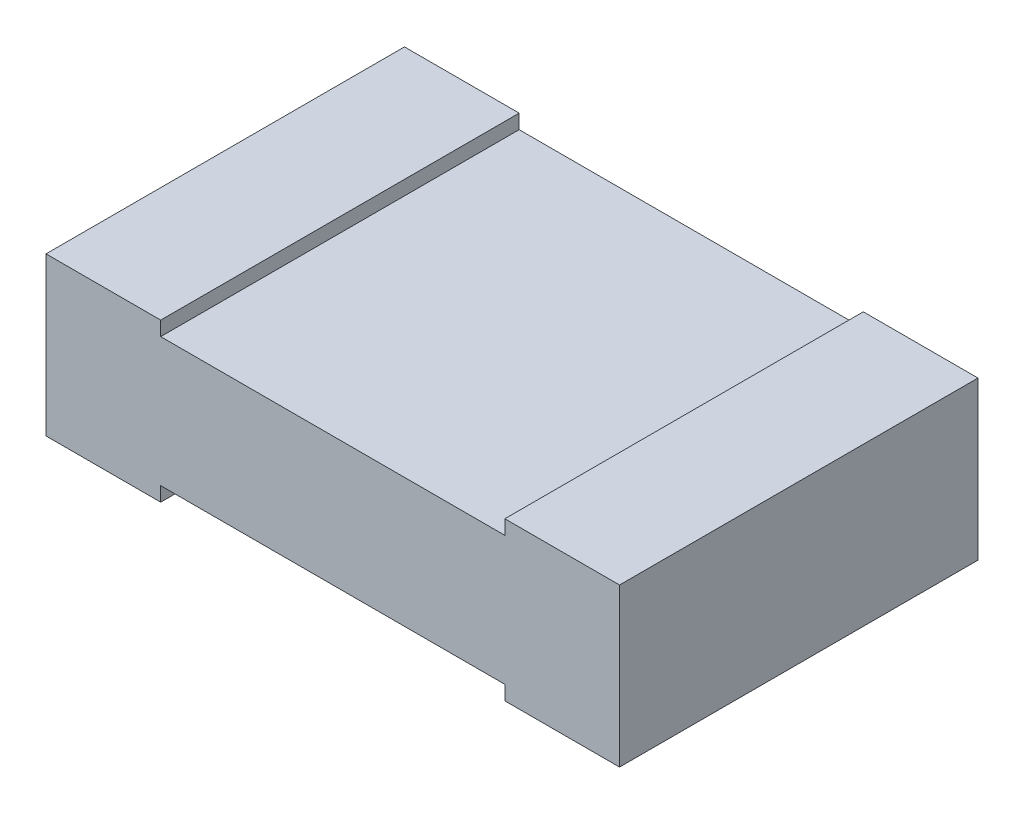
ISO-10303-21;
HEADER;
FILE_DESCRIPTION(('STEP AP214'),'2;1');
FILE_NAME('part.step','',(''),(''),'','','');
FILE_SCHEMA(('AUTOMOTIVE_DESIGN { 1 0 10303 214 1 1 1 1 }'));
ENDSEC;
DATA;
#1=APPLICATION_CONTEXT('core data for automotive mechanical design processes');
#2=APPLICATION_PROTOCOL_DEFINITION('international standard','automotive_design',2000,#1);
#3=PRODUCT_CONTEXT('',#1,'mechanical');
#4=PRODUCT('Part','Part','',(#3));
#5=PRODUCT_RELATED_PRODUCT_CATEGORY('part','',(#4));
#6=PRODUCT_DEFINITION_FORMATION('','',#4);
#7=PRODUCT_DEFINITION_CONTEXT('part definition',#1,'design');
#8=PRODUCT_DEFINITION('design','',#6,#7);
#9=PRODUCT_DEFINITION_SHAPE('','',#8);
#10=(LENGTH_UNIT() NAMED_UNIT(*) SI_UNIT(.MILLI.,.METRE.));
#11=(NAMED_UNIT(*) PLANE_ANGLE_UNIT() SI_UNIT($,.RADIAN.));
#12=(NAMED_UNIT(*) SI_UNIT($,.STERADIAN.) SOLID_ANGLE_UNIT());
#13=UNCERTAINTY_MEASURE_WITH_UNIT(LENGTH_MEASURE(1.E-05),#10,'distance_accuracy_value','');
#14=(GEOMETRIC_REPRESENTATION_CONTEXT(3) GLOBAL_UNCERTAINTY_ASSIGNED_CONTEXT((#13)) GLOBAL_UNIT_ASSIGNED_CONTEXT((#10,
#11,#12)) REPRESENTATION_CONTEXT('',''));
#15=CARTESIAN_POINT('',(0.,0.,0.));
#16=DIRECTION('',(0.,0.,1.));
#17=DIRECTION('',(1.,0.,0.));
#18=AXIS2_PLACEMENT_3D('',#15,#16,#17);
#19=CARTESIAN_POINT('',(-1.,0.55,-0.625));
#20=DIRECTION('',(1.,0.,0.));
#21=DIRECTION('',(0.,0.,-1.));
#22=AXIS2_PLACEMENT_3D('',#19,#20,#21);
#23=PLANE('',#22);
#24=DIRECTION('',(0.,1.,0.));
#25=VECTOR('',#24,1.);
#26=CARTESIAN_POINT('',(-1.,0.55,0.625));
#27=LINE('',#26,#25);
#28=CARTESIAN_POINT('',(-1.,0.,0.625));
#29=VERTEX_POINT('',#28);
#30=CARTESIAN_POINT('',(-1.,0.55,0.625));
#31=VERTEX_POINT('',#30);
#32=EDGE_CURVE('E158',#29,#31,#27,.T.);
#33=ORIENTED_EDGE('',*,*,#32,.T.);
#34=DIRECTION('',(0.,0.,1.));
#35=VECTOR('',#34,1.);
#36=CARTESIAN_POINT('',(-1.,0.55,0.625));
#37=LINE('',#36,#35);
#38=CARTESIAN_POINT('',(-1.,0.55,-0.625));
#39=VERTEX_POINT('',#38);
#40=EDGE_CURVE('E21',#39,#31,#37,.T.);
#41=ORIENTED_EDGE('',*,*,#40,.F.);
#42=DIRECTION('',(0.,1.,0.));
#43=VECTOR('',#42,1.);
#44=CARTESIAN_POINT('',(-1.,0.55,-0.625));
#45=LINE('',#44,#43);
#46=CARTESIAN_POINT('',(-1.,0.,-0.625));
#47=VERTEX_POINT('',#46);
#48=EDGE_CURVE('E107',#39,#47,#45,.F.);
#49=ORIENTED_EDGE('',*,*,#48,.T.);
#50=DIRECTION('',(0.,0.,1.));
#51=VECTOR('',#50,1.);
#52=CARTESIAN_POINT('',(-1.,0.,0.625));
#53=LINE('',#52,#51);
#54=EDGE_CURVE('E109',#47,#29,#53,.T.);
#55=ORIENTED_EDGE('',*,*,#54,.T.);
#56=EDGE_LOOP('',(#33,#41,#49,#55));
#57=FACE_BOUND('',#56,.T.);
#58=ADVANCED_FACE('F18',(#57),#23,.F.);
#59=CARTESIAN_POINT('',(-1.,0.55,0.625));
#60=DIRECTION('',(0.,1.,0.));
#61=DIRECTION('',(0.,0.,1.));
#62=AXIS2_PLACEMENT_3D('',#59,#60,#61);
#63=PLANE('',#62);
#64=ORIENTED_EDGE('',*,*,#40,.T.);
#65=DIRECTION('',(-1.,0.,0.));
#66=VECTOR('',#65,1.);
#67=CARTESIAN_POINT('',(-1.,0.55,0.625));
#68=LINE('',#67,#66);
#69=CARTESIAN_POINT('',(-0.6,0.55,0.625));
#70=VERTEX_POINT('',#69);
#71=EDGE_CURVE('E152',#31,#70,#68,.F.);
#72=ORIENTED_EDGE('',*,*,#71,.T.);
#73=DIRECTION('',(0.,0.,1.));
#74=VECTOR('',#73,1.);
#75=CARTESIAN_POINT('',(-0.6,0.55,-0.625));
#76=LINE('',#75,#74);
#77=CARTESIAN_POINT('',(-0.6,0.55,-0.625));
#78=VERTEX_POINT('',#77);
#79=EDGE_CURVE('E168',#70,#78,#76,.F.);
#80=ORIENTED_EDGE('',*,*,#79,.T.);
#81=DIRECTION('',(1.,0.,0.));
#82=VECTOR('',#81,1.);
#83=CARTESIAN_POINT('',(-1.,0.55,-0.625));
#84=LINE('',#83,#82);
#85=EDGE_CURVE('E154',#78,#39,#84,.F.);
#86=ORIENTED_EDGE('',*,*,#85,.T.);
#87=EDGE_LOOP('',(#64,#72,#80,#86));
#88=FACE_BOUND('',#87,.T.);
#89=ADVANCED_FACE('F151',(#88),#63,.T.);
#90=CARTESIAN_POINT('',(1.,0.55,-0.625));
#91=DIRECTION('',(-1.,0.,0.));
#92=DIRECTION('',(0.,0.,1.));
#93=AXIS2_PLACEMENT_3D('',#90,#91,#92);
#94=PLANE('',#93);
#95=DIRECTION('',(0.,1.,0.));
#96=VECTOR('',#95,1.);
#97=CARTESIAN_POINT('',(1.,0.55,-0.625));
#98=LINE('',#97,#96);
#99=CARTESIAN_POINT('',(1.,0.,-0.625));
#100=VERTEX_POINT('',#99);
#101=CARTESIAN_POINT('',(1.,0.55,-0.625));
#102=VERTEX_POINT('',#101);
#103=EDGE_CURVE('E173',#100,#102,#98,.T.);
#104=ORIENTED_EDGE('',*,*,#103,.T.);
#105=DIRECTION('',(0.,0.,1.));
#106=VECTOR('',#105,1.);
#107=CARTESIAN_POINT('',(1.,0.55,0.625));
#108=LINE('',#107,#106);
#109=CARTESIAN_POINT('',(1.,0.55,0.625));
#110=VERTEX_POINT('',#109);
#111=EDGE_CURVE('E115',#110,#102,#108,.F.);
#112=ORIENTED_EDGE('',*,*,#111,.F.);
#113=DIRECTION('',(0.,1.,0.));
#114=VECTOR('',#113,1.);
#115=CARTESIAN_POINT('',(1.,0.55,0.625));
#116=LINE('',#115,#114);
#117=CARTESIAN_POINT('',(1.,0.,0.625));
#118=VERTEX_POINT('',#117);
#119=EDGE_CURVE('E198',#110,#118,#116,.F.);
#120=ORIENTED_EDGE('',*,*,#119,.T.);
#121=DIRECTION('',(0.,0.,1.));
#122=VECTOR('',#121,1.);
#123=CARTESIAN_POINT('',(1.,0.,0.625));
#124=LINE('',#123,#122);
#125=EDGE_CURVE('E145',#118,#100,#124,.F.);
#126=ORIENTED_EDGE('',*,*,#125,.T.);
#127=EDGE_LOOP('',(#104,#112,#120,#126));
#128=FACE_BOUND('',#127,.T.);
#129=ADVANCED_FACE('F209',(#128),#94,.F.);
#130=CARTESIAN_POINT('',(-1.,0.,0.625));
#131=DIRECTION('',(0.,1.,0.));
#132=DIRECTION('',(0.,0.,1.));
#133=AXIS2_PLACEMENT_3D('',#130,#131,#132);
#134=PLANE('',#133);
#135=DIRECTION('',(0.,0.,-1.));
#136=VECTOR('',#135,1.);
#137=CARTESIAN_POINT('',(0.6,0.,-0.625));
#138=LINE('',#137,#136);
#139=CARTESIAN_POINT('',(0.6,0.,0.625));
#140=VERTEX_POINT('',#139);
#141=CARTESIAN_POINT('',(0.6,0.,-0.625));
#142=VERTEX_POINT('',#141);
#143=EDGE_CURVE('E144',#140,#142,#138,.T.);
#144=ORIENTED_EDGE('',*,*,#143,.T.);
#145=DIRECTION('',(1.,0.,0.));
#146=VECTOR('',#145,1.);
#147=CARTESIAN_POINT('',(-1.,0.,-0.625));
#148=LINE('',#147,#146);
#149=EDGE_CURVE('E175',#142,#100,#148,.T.);
#150=ORIENTED_EDGE('',*,*,#149,.T.);
#151=ORIENTED_EDGE('',*,*,#125,.F.);
#152=DIRECTION('',(-1.,0.,0.));
#153=VECTOR('',#152,1.);
#154=CARTESIAN_POINT('',(-1.,0.,0.625));
#155=LINE('',#154,#153);
#156=EDGE_CURVE('E194',#118,#140,#155,.T.);
#157=ORIENTED_EDGE('',*,*,#156,.T.);
#158=EDGE_LOOP('',(#144,#150,#151,#157));
#159=FACE_BOUND('',#158,.T.);
#160=ADVANCED_FACE('F211',(#159),#134,.F.);
#161=CARTESIAN_POINT('',(0.6,0.76960361415042,-0.625));
#162=DIRECTION('',(1.,0.,0.));
#163=DIRECTION('',(0.,0.,-1.));
#164=AXIS2_PLACEMENT_3D('',#161,#162,#163);
#165=PLANE('',#164);
#166=DIRECTION('',(0.,1.,0.));
#167=VECTOR('',#166,1.);
#168=CARTESIAN_POINT('',(0.6,0.55,-0.625));
#169=LINE('',#168,#167);
#170=CARTESIAN_POINT('',(0.6,0.0499999999999999,-0.625));
#171=VERTEX_POINT('',#170);
#172=EDGE_CURVE('E177',#171,#142,#169,.F.);
#173=ORIENTED_EDGE('',*,*,#172,.T.);
#174=ORIENTED_EDGE('',*,*,#143,.F.);
#175=DIRECTION('',(0.,1.,0.));
#176=VECTOR('',#175,1.);
#177=CARTESIAN_POINT('',(0.6,0.55,0.625));
#178=LINE('',#177,#176);
#179=CARTESIAN_POINT('',(0.6,0.0499999999999999,0.625));
#180=VERTEX_POINT('',#179);
#181=EDGE_CURVE('E191',#140,#180,#178,.T.);
#182=ORIENTED_EDGE('',*,*,#181,.T.);
#183=DIRECTION('',(0.,0.,-1.));
#184=VECTOR('',#183,1.);
#185=CARTESIAN_POINT('',(0.6,0.0499999999999999,-1.90660056179763));
#186=LINE('',#185,#184);
#187=EDGE_CURVE('E141',#171,#180,#186,.F.);
#188=ORIENTED_EDGE('',*,*,#187,.F.);
#189=EDGE_LOOP('',(#173,#174,#182,#188));
#190=FACE_BOUND('',#189,.T.);
#191=ADVANCED_FACE('F189',(#190),#165,.F.);
#192=CARTESIAN_POINT('',(-0.6,0.0499999999999999,-1.90660056179763));
#193=DIRECTION('',(0.,-1.,0.));
#194=DIRECTION('',(0.,0.,-1.));
#195=AXIS2_PLACEMENT_3D('',#192,#193,#194);
#196=PLANE('',#195);
#197=DIRECTION('',(-1.,0.,0.));
#198=VECTOR('',#197,1.);
#199=CARTESIAN_POINT('',(-1.,0.0499999999999999,0.625));
#200=LINE('',#199,#198);
#201=CARTESIAN_POINT('',(-0.6,0.0499999999999999,0.625));
#202=VERTEX_POINT('',#201);
#203=EDGE_CURVE('E193',#180,#202,#200,.T.);
#204=ORIENTED_EDGE('',*,*,#203,.T.);
#205=DIRECTION('',(0.,0.,1.));
#206=VECTOR('',#205,1.);
#207=CARTESIAN_POINT('',(-0.6,0.0499999999999999,-0.625));
#208=LINE('',#207,#206);
#209=CARTESIAN_POINT('',(-0.6,0.0499999999999999,-0.625));
#210=VERTEX_POINT('',#209);
#211=EDGE_CURVE('E126',#202,#210,#208,.F.);
#212=ORIENTED_EDGE('',*,*,#211,.T.);
#213=DIRECTION('',(1.,0.,0.));
#214=VECTOR('',#213,1.);
#215=CARTESIAN_POINT('',(-1.,0.0499999999999999,-0.625));
#216=LINE('',#215,#214);
#217=EDGE_CURVE('E133',#210,#171,#216,.T.);
#218=ORIENTED_EDGE('',*,*,#217,.T.);
#219=ORIENTED_EDGE('',*,*,#187,.T.);
#220=EDGE_LOOP('',(#204,#212,#218,#219));
#221=FACE_BOUND('',#220,.T.);
#222=ADVANCED_FACE('F182',(#221),#196,.T.);
#223=CARTESIAN_POINT('',(-0.6,-0.219603614150421,-0.625));
#224=DIRECTION('',(-1.,0.,0.));
#225=DIRECTION('',(0.,0.,1.));
#226=AXIS2_PLACEMENT_3D('',#223,#224,#225);
#227=PLANE('',#226);
#228=ORIENTED_EDGE('',*,*,#211,.F.);
#229=DIRECTION('',(0.,1.,0.));
#230=VECTOR('',#229,1.);
#231=CARTESIAN_POINT('',(-0.6,0.55,0.625));
#232=LINE('',#231,#230);
#233=CARTESIAN_POINT('',(-0.6,0.,0.625));
#234=VERTEX_POINT('',#233);
#235=EDGE_CURVE('E196',#202,#234,#232,.F.);
#236=ORIENTED_EDGE('',*,*,#235,.T.);
#237=DIRECTION('',(0.,0.,1.));
#238=VECTOR('',#237,1.);
#239=CARTESIAN_POINT('',(-0.6,0.,0.625));
#240=LINE('',#239,#238);
#241=CARTESIAN_POINT('',(-0.6,0.,-0.625));
#242=VERTEX_POINT('',#241);
#243=EDGE_CURVE('E125',#234,#242,#240,.F.);
#244=ORIENTED_EDGE('',*,*,#243,.T.);
#245=DIRECTION('',(0.,1.,0.));
#246=VECTOR('',#245,1.);
#247=CARTESIAN_POINT('',(-0.6,0.55,-0.625));
#248=LINE('',#247,#246);
#249=EDGE_CURVE('E131',#242,#210,#248,.T.);
#250=ORIENTED_EDGE('',*,*,#249,.T.);
#251=EDGE_LOOP('',(#228,#236,#244,#250));
#252=FACE_BOUND('',#251,.T.);
#253=ADVANCED_FACE('F224',(#252),#227,.F.);
#254=CARTESIAN_POINT('',(-1.,0.,0.625));
#255=DIRECTION('',(0.,1.,0.));
#256=DIRECTION('',(0.,0.,1.));
#257=AXIS2_PLACEMENT_3D('',#254,#255,#256);
#258=PLANE('',#257);
#259=ORIENTED_EDGE('',*,*,#243,.F.);
#260=DIRECTION('',(-1.,0.,0.));
#261=VECTOR('',#260,1.);
#262=CARTESIAN_POINT('',(-1.,0.,0.625));
#263=LINE('',#262,#261);
#264=EDGE_CURVE('E123',#234,#29,#263,.T.);
#265=ORIENTED_EDGE('',*,*,#264,.T.);
#266=ORIENTED_EDGE('',*,*,#54,.F.);
#267=DIRECTION('',(1.,0.,0.));
#268=VECTOR('',#267,1.);
#269=CARTESIAN_POINT('',(-1.,0.,-0.625));
#270=LINE('',#269,#268);
#271=EDGE_CURVE('E114',#47,#242,#270,.T.);
#272=ORIENTED_EDGE('',*,*,#271,.T.);
#273=EDGE_LOOP('',(#259,#265,#266,#272));
#274=FACE_BOUND('',#273,.T.);
#275=ADVANCED_FACE('F120',(#274),#258,.F.);
#276=CARTESIAN_POINT('',(-1.,0.55,0.625));
#277=DIRECTION('',(0.,1.,0.));
#278=DIRECTION('',(0.,0.,1.));
#279=AXIS2_PLACEMENT_3D('',#276,#277,#278);
#280=PLANE('',#279);
#281=ORIENTED_EDGE('',*,*,#111,.T.);
#282=DIRECTION('',(1.,0.,0.));
#283=VECTOR('',#282,1.);
#284=CARTESIAN_POINT('',(-1.,0.55,-0.625));
#285=LINE('',#284,#283);
#286=CARTESIAN_POINT('',(0.6,0.55,-0.625));
#287=VERTEX_POINT('',#286);
#288=EDGE_CURVE('E171',#102,#287,#285,.F.);
#289=ORIENTED_EDGE('',*,*,#288,.T.);
#290=DIRECTION('',(0.,0.,-1.));
#291=VECTOR('',#290,1.);
#292=CARTESIAN_POINT('',(0.6,0.55,-0.625));
#293=LINE('',#292,#291);
#294=CARTESIAN_POINT('',(0.6,0.55,0.625));
#295=VERTEX_POINT('',#294);
#296=EDGE_CURVE('E208',#287,#295,#293,.F.);
#297=ORIENTED_EDGE('',*,*,#296,.T.);
#298=DIRECTION('',(-1.,0.,0.));
#299=VECTOR('',#298,1.);
#300=CARTESIAN_POINT('',(-1.,0.55,0.625));
#301=LINE('',#300,#299);
#302=EDGE_CURVE('E161',#295,#110,#301,.F.);
#303=ORIENTED_EDGE('',*,*,#302,.T.);
#304=EDGE_LOOP('',(#281,#289,#297,#303));
#305=FACE_BOUND('',#304,.T.);
#306=ADVANCED_FACE('F205',(#305),#280,.T.);
#307=CARTESIAN_POINT('',(-1.,0.55,-0.625));
#308=DIRECTION('',(0.,0.,1.));
#309=DIRECTION('',(1.,0.,0.));
#310=AXIS2_PLACEMENT_3D('',#307,#308,#309);
#311=PLANE('',#310);
#312=DIRECTION('',(0.,1.,0.));
#313=VECTOR('',#312,1.);
#314=CARTESIAN_POINT('',(-0.6,-0.219603614150421,-0.625));
#315=LINE('',#314,#313);
#316=CARTESIAN_POINT('',(-0.6,0.5,-0.625));
#317=VERTEX_POINT('',#316);
#318=EDGE_CURVE('E163',#78,#317,#315,.F.);
#319=ORIENTED_EDGE('',*,*,#318,.T.);
#320=DIRECTION('',(1.,0.,0.));
#321=VECTOR('',#320,1.);
#322=CARTESIAN_POINT('',(-0.6,0.5,-0.625));
#323=LINE('',#322,#321);
#324=CARTESIAN_POINT('',(0.6,0.5,-0.625));
#325=VERTEX_POINT('',#324);
#326=EDGE_CURVE('E216',#325,#317,#323,.F.);
#327=ORIENTED_EDGE('',*,*,#326,.F.);
#328=DIRECTION('',(0.,1.,0.));
#329=VECTOR('',#328,1.);
#330=CARTESIAN_POINT('',(0.6,0.76960361415042,-0.625));
#331=LINE('',#330,#329);
#332=EDGE_CURVE('E214',#325,#287,#331,.T.);
#333=ORIENTED_EDGE('',*,*,#332,.T.);
#334=ORIENTED_EDGE('',*,*,#288,.F.);
#335=ORIENTED_EDGE('',*,*,#103,.F.);
#336=ORIENTED_EDGE('',*,*,#149,.F.);
#337=ORIENTED_EDGE('',*,*,#172,.F.);
#338=ORIENTED_EDGE('',*,*,#217,.F.);
#339=ORIENTED_EDGE('',*,*,#249,.F.);
#340=ORIENTED_EDGE('',*,*,#271,.F.);
#341=ORIENTED_EDGE('',*,*,#48,.F.);
#342=ORIENTED_EDGE('',*,*,#85,.F.);
#343=EDGE_LOOP('',(#319,#327,#333,#334,#335,#336,#337,#338,#339,#340,#341,#342));
#344=FACE_BOUND('',#343,.T.);
#345=ADVANCED_FACE('F128',(#344),#311,.F.);
#346=CARTESIAN_POINT('',(-0.6,-0.219603614150421,-0.625));
#347=DIRECTION('',(-1.,0.,0.));
#348=DIRECTION('',(0.,0.,1.));
#349=AXIS2_PLACEMENT_3D('',#346,#347,#348);
#350=PLANE('',#349);
#351=ORIENTED_EDGE('',*,*,#318,.F.);
#352=ORIENTED_EDGE('',*,*,#79,.F.);
#353=DIRECTION('',(0.,1.,0.));
#354=VECTOR('',#353,1.);
#355=CARTESIAN_POINT('',(-0.6,0.55,0.625));
#356=LINE('',#355,#354);
#357=CARTESIAN_POINT('',(-0.6,0.5,0.625));
#358=VERTEX_POINT('',#357);
#359=EDGE_CURVE('E159',#70,#358,#356,.F.);
#360=ORIENTED_EDGE('',*,*,#359,.T.);
#361=DIRECTION('',(0.,0.,1.));
#362=VECTOR('',#361,1.);
#363=CARTESIAN_POINT('',(-0.6,0.5,-1.90660056179763));
#364=LINE('',#363,#362);
#365=EDGE_CURVE('E390',#317,#358,#364,.T.);
#366=ORIENTED_EDGE('',*,*,#365,.F.);
#367=EDGE_LOOP('',(#351,#352,#360,#366));
#368=FACE_BOUND('',#367,.T.);
#369=ADVANCED_FACE('F246',(#368),#350,.F.);
#370=CARTESIAN_POINT('',(-1.,0.55,0.625));
#371=DIRECTION('',(0.,0.,-1.));
#372=DIRECTION('',(-1.,0.,0.));
#373=AXIS2_PLACEMENT_3D('',#370,#371,#372);
#374=PLANE('',#373);
#375=ORIENTED_EDGE('',*,*,#235,.F.);
#376=ORIENTED_EDGE('',*,*,#203,.F.);
#377=ORIENTED_EDGE('',*,*,#181,.F.);
#378=ORIENTED_EDGE('',*,*,#156,.F.);
#379=ORIENTED_EDGE('',*,*,#119,.F.);
#380=ORIENTED_EDGE('',*,*,#302,.F.);
#381=DIRECTION('',(0.,1.,0.));
#382=VECTOR('',#381,1.);
#383=CARTESIAN_POINT('',(0.6,0.76960361415042,0.625));
#384=LINE('',#383,#382);
#385=CARTESIAN_POINT('',(0.6,0.5,0.625));
#386=VERTEX_POINT('',#385);
#387=EDGE_CURVE('E36',#295,#386,#384,.F.);
#388=ORIENTED_EDGE('',*,*,#387,.T.);
#389=DIRECTION('',(1.,0.,0.));
#390=VECTOR('',#389,1.);
#391=CARTESIAN_POINT('',(-0.6,0.5,0.625));
#392=LINE('',#391,#390);
#393=EDGE_CURVE('E27',#358,#386,#392,.T.);
#394=ORIENTED_EDGE('',*,*,#393,.F.);
#395=ORIENTED_EDGE('',*,*,#359,.F.);
#396=ORIENTED_EDGE('',*,*,#71,.F.);
#397=ORIENTED_EDGE('',*,*,#32,.F.);
#398=ORIENTED_EDGE('',*,*,#264,.F.);
#399=EDGE_LOOP('',(#375,#376,#377,#378,#379,#380,#388,#394,#395,#396,#397,#398));
#400=FACE_BOUND('',#399,.T.);
#401=ADVANCED_FACE('F157',(#400),#374,.F.);
#402=CARTESIAN_POINT('',(0.6,0.76960361415042,-0.625));
#403=DIRECTION('',(1.,0.,0.));
#404=DIRECTION('',(0.,0.,-1.));
#405=AXIS2_PLACEMENT_3D('',#402,#403,#404);
#406=PLANE('',#405);
#407=DIRECTION('',(0.,0.,1.));
#408=VECTOR('',#407,1.);
#409=CARTESIAN_POINT('',(0.6,0.5,-1.90660056179763));
#410=LINE('',#409,#408);
#411=EDGE_CURVE('E11',#386,#325,#410,.F.);
#412=ORIENTED_EDGE('',*,*,#411,.F.);
#413=ORIENTED_EDGE('',*,*,#387,.F.);
#414=ORIENTED_EDGE('',*,*,#296,.F.);
#415=ORIENTED_EDGE('',*,*,#332,.F.);
#416=EDGE_LOOP('',(#412,#413,#414,#415));
#417=FACE_BOUND('',#416,.T.);
#418=ADVANCED_FACE('F219',(#417),#406,.F.);
#419=CARTESIAN_POINT('',(-0.6,0.5,-1.90660056179763));
#420=DIRECTION('',(0.,1.,0.));
#421=DIRECTION('',(0.,0.,1.));
#422=AXIS2_PLACEMENT_3D('',#419,#420,#421);
#423=PLANE('',#422);
#424=ORIENTED_EDGE('',*,*,#393,.T.);
#425=ORIENTED_EDGE('',*,*,#411,.T.);
#426=ORIENTED_EDGE('',*,*,#326,.T.);
#427=ORIENTED_EDGE('',*,*,#365,.T.);
#428=EDGE_LOOP('',(#424,#425,#426,#427));
#429=FACE_BOUND('',#428,.T.);
#430=ADVANCED_FACE('F234',(#429),#423,.T.);
#431=CLOSED_SHELL('',(#58,#89,#129,#160,#191,#222,#253,#275,#306,#345,#369,#401,#418,#430));
#432=MANIFOLD_SOLID_BREP('B1',#431);
#433=ADVANCED_BREP_SHAPE_REPRESENTATION('',(#18,#432),#14);
#434=SHAPE_DEFINITION_REPRESENTATION(#9,#433);
ENDSEC;
END-ISO-10303-21;
